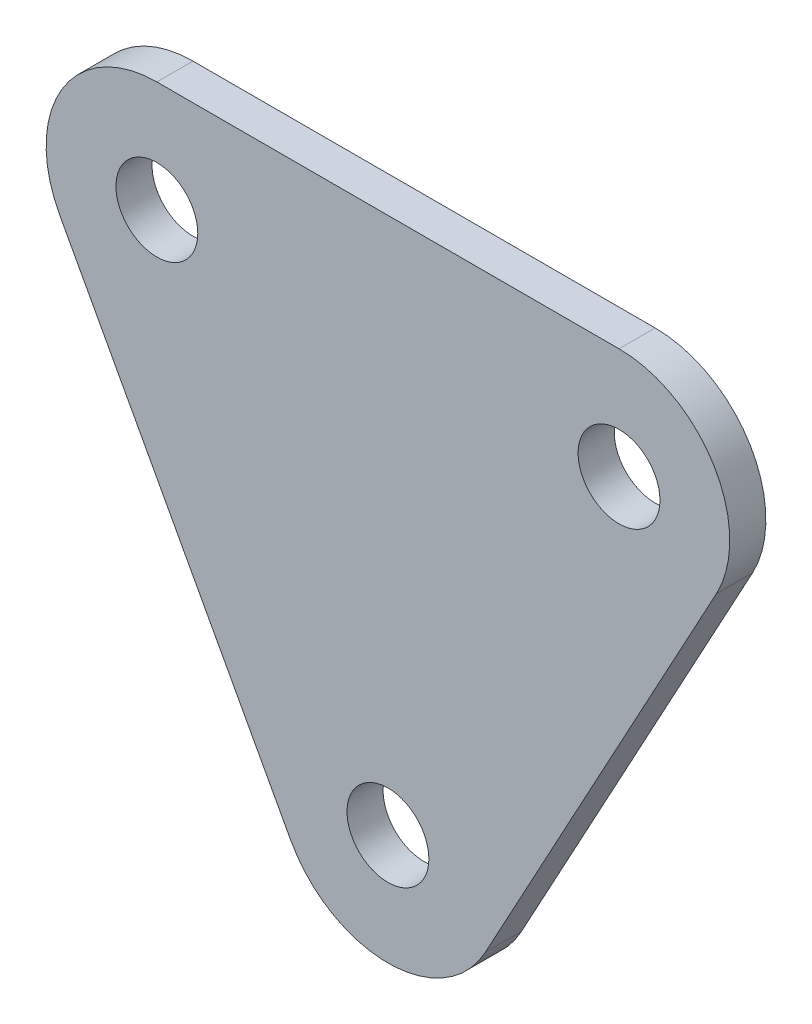
ISO-10303-21;
HEADER;
FILE_DESCRIPTION(('STEP AP214'),'2;1');
FILE_NAME('part.step','',(''),(''),'','','');
FILE_SCHEMA(('AUTOMOTIVE_DESIGN { 1 0 10303 214 1 1 1 1 }'));
ENDSEC;
DATA;
#1=APPLICATION_CONTEXT('core data for automotive mechanical design processes');
#2=APPLICATION_PROTOCOL_DEFINITION('international standard','automotive_design',2000,#1);
#3=PRODUCT_CONTEXT('',#1,'mechanical');
#4=PRODUCT('Part','Part','',(#3));
#5=PRODUCT_RELATED_PRODUCT_CATEGORY('part','',(#4));
#6=PRODUCT_DEFINITION_FORMATION('','',#4);
#7=PRODUCT_DEFINITION_CONTEXT('part definition',#1,'design');
#8=PRODUCT_DEFINITION('design','',#6,#7);
#9=PRODUCT_DEFINITION_SHAPE('','',#8);
#10=(LENGTH_UNIT() NAMED_UNIT(*) SI_UNIT(.MILLI.,.METRE.));
#11=(NAMED_UNIT(*) PLANE_ANGLE_UNIT() SI_UNIT($,.RADIAN.));
#12=(NAMED_UNIT(*) SI_UNIT($,.STERADIAN.) SOLID_ANGLE_UNIT());
#13=UNCERTAINTY_MEASURE_WITH_UNIT(LENGTH_MEASURE(1.E-05),#10,'distance_accuracy_value','');
#14=(GEOMETRIC_REPRESENTATION_CONTEXT(3) GLOBAL_UNCERTAINTY_ASSIGNED_CONTEXT((#13)) GLOBAL_UNIT_ASSIGNED_CONTEXT((#10,
#11,#12)) REPRESENTATION_CONTEXT('',''));
#15=CARTESIAN_POINT('',(0.,0.,0.));
#16=DIRECTION('',(0.,0.,1.));
#17=DIRECTION('',(1.,0.,0.));
#18=AXIS2_PLACEMENT_3D('',#15,#16,#17);
#19=CARTESIAN_POINT('',(86.6397258626879,-111.5,7.5));
#20=DIRECTION('',(0.,0.,-1.));
#21=DIRECTION('',(-1.,0.,0.));
#22=AXIS2_PLACEMENT_3D('',#19,#20,#21);
#23=PLANE('',#22);
#24=CARTESIAN_POINT('',(86.6397258626879,-111.5,7.5));
#25=DIRECTION('',(0.,0.,1.));
#26=DIRECTION('',(-1.,0.,0.));
#27=AXIS2_PLACEMENT_3D('',#24,#25,#26);
#28=CIRCLE('',#27,23.);
#29=CARTESIAN_POINT('',(66.4219931816631,-122.465549928691,7.5));
#30=VERTEX_POINT('',#29);
#31=CARTESIAN_POINT('',(106.857458543713,-122.465549928691,7.5));
#32=VERTEX_POINT('',#31);
#33=EDGE_CURVE('E129',#30,#32,#28,.T.);
#34=ORIENTED_EDGE('',*,*,#33,.T.);
#35=DIRECTION('',(0.476763040377887,0.879031855696728,0.));
#36=VECTOR('',#35,1.);
#37=CARTESIAN_POINT('',(154.857458543713,-33.9655499286914,7.5));
#38=LINE('',#37,#36);
#39=CARTESIAN_POINT('',(154.857458543713,-33.9655499286914,7.5));
#40=VERTEX_POINT('',#39);
#41=EDGE_CURVE('E87',#32,#40,#38,.T.);
#42=ORIENTED_EDGE('',*,*,#41,.T.);
#43=CARTESIAN_POINT('',(134.639725862688,-23.,7.5));
#44=DIRECTION('',(0.,0.,1.));
#45=DIRECTION('',(-1.,0.,0.));
#46=AXIS2_PLACEMENT_3D('',#43,#44,#45);
#47=CIRCLE('',#46,23.);
#48=CARTESIAN_POINT('',(134.639725862688,0.,7.5));
#49=VERTEX_POINT('',#48);
#50=EDGE_CURVE('E100',#40,#49,#47,.T.);
#51=ORIENTED_EDGE('',*,*,#50,.T.);
#52=DIRECTION('',(-1.,0.,0.));
#53=VECTOR('',#52,1.);
#54=CARTESIAN_POINT('',(38.6397258626879,0.,7.5));
#55=LINE('',#54,#53);
#56=CARTESIAN_POINT('',(38.6397258626879,0.,7.5));
#57=VERTEX_POINT('',#56);
#58=EDGE_CURVE('E94',#49,#57,#55,.T.);
#59=ORIENTED_EDGE('',*,*,#58,.T.);
#60=CARTESIAN_POINT('',(38.6397258626879,-23.,7.5));
#61=DIRECTION('',(0.,0.,1.));
#62=DIRECTION('',(1.,0.,0.));
#63=AXIS2_PLACEMENT_3D('',#60,#61,#62);
#64=CIRCLE('',#63,23.);
#65=CARTESIAN_POINT('',(18.4219931816631,-33.9655499286914,7.5));
#66=VERTEX_POINT('',#65);
#67=EDGE_CURVE('E98',#57,#66,#64,.T.);
#68=ORIENTED_EDGE('',*,*,#67,.T.);
#69=DIRECTION('',(0.476763040377886,-0.879031855696728,0.));
#70=VECTOR('',#69,1.);
#71=CARTESIAN_POINT('',(66.4219931816631,-122.465549928691,7.5));
#72=LINE('',#71,#70);
#73=EDGE_CURVE('E50',#66,#30,#72,.T.);
#74=ORIENTED_EDGE('',*,*,#73,.T.);
#75=EDGE_LOOP('',(#34,#42,#51,#59,#68,#74));
#76=FACE_BOUND('',#75,.T.);
#77=CARTESIAN_POINT('',(38.6397258626879,-23.,7.5));
#78=DIRECTION('',(0.,0.,1.));
#79=DIRECTION('',(1.,0.,0.));
#80=AXIS2_PLACEMENT_3D('',#77,#78,#79);
#81=CIRCLE('',#80,8.5);
#82=CARTESIAN_POINT('',(47.1397258626879,-23.,7.5));
#83=VERTEX_POINT('',#82);
#84=EDGE_CURVE('E122',#83,#83,#81,.T.);
#85=ORIENTED_EDGE('',*,*,#84,.F.);
#86=EDGE_LOOP('',(#85));
#87=FACE_BOUND('',#86,.T.);
#88=CARTESIAN_POINT('',(134.639725862688,-23.,7.5));
#89=DIRECTION('',(0.,0.,1.));
#90=DIRECTION('',(1.,0.,0.));
#91=AXIS2_PLACEMENT_3D('',#88,#89,#90);
#92=CIRCLE('',#91,8.50000000000001);
#93=CARTESIAN_POINT('',(143.139725862688,-23.,7.5));
#94=VERTEX_POINT('',#93);
#95=EDGE_CURVE('E183',#94,#94,#92,.T.);
#96=ORIENTED_EDGE('',*,*,#95,.F.);
#97=EDGE_LOOP('',(#96));
#98=FACE_BOUND('',#97,.T.);
#99=CARTESIAN_POINT('',(86.6397258626879,-111.5,7.5));
#100=DIRECTION('',(0.,0.,1.));
#101=DIRECTION('',(1.,0.,0.));
#102=AXIS2_PLACEMENT_3D('',#99,#100,#101);
#103=CIRCLE('',#102,8.49999999999999);
#104=CARTESIAN_POINT('',(95.1397258626879,-111.5,7.5));
#105=VERTEX_POINT('',#104);
#106=EDGE_CURVE('E174',#105,#105,#103,.T.);
#107=ORIENTED_EDGE('',*,*,#106,.F.);
#108=EDGE_LOOP('',(#107));
#109=FACE_BOUND('',#108,.T.);
#110=ADVANCED_FACE('F33',(#76,#87,#98,#109),#23,.F.);
#111=CARTESIAN_POINT('',(86.6397258626879,-111.5,0.));
#112=DIRECTION('',(0.,0.,-1.));
#113=DIRECTION('',(-1.,0.,0.));
#114=AXIS2_PLACEMENT_3D('',#111,#112,#113);
#115=PLANE('',#114);
#116=CARTESIAN_POINT('',(134.639725862688,-23.,0.));
#117=DIRECTION('',(0.,0.,1.));
#118=DIRECTION('',(1.,0.,0.));
#119=AXIS2_PLACEMENT_3D('',#116,#117,#118);
#120=CIRCLE('',#119,8.50000000000001);
#121=CARTESIAN_POINT('',(143.139725862688,-23.,0.));
#122=VERTEX_POINT('',#121);
#123=EDGE_CURVE('E180',#122,#122,#120,.T.);
#124=ORIENTED_EDGE('',*,*,#123,.T.);
#125=EDGE_LOOP('',(#124));
#126=FACE_BOUND('',#125,.T.);
#127=CARTESIAN_POINT('',(86.6397258626879,-111.5,0.));
#128=DIRECTION('',(0.,0.,1.));
#129=DIRECTION('',(-1.,0.,0.));
#130=AXIS2_PLACEMENT_3D('',#127,#128,#129);
#131=CIRCLE('',#130,23.);
#132=CARTESIAN_POINT('',(66.4219931816631,-122.465549928691,0.));
#133=VERTEX_POINT('',#132);
#134=CARTESIAN_POINT('',(106.857458543713,-122.465549928691,0.));
#135=VERTEX_POINT('',#134);
#136=EDGE_CURVE('E118',#133,#135,#131,.T.);
#137=ORIENTED_EDGE('',*,*,#136,.F.);
#138=DIRECTION('',(0.476763040377886,-0.879031855696728,0.));
#139=VECTOR('',#138,1.);
#140=CARTESIAN_POINT('',(66.4219931816631,-122.465549928691,0.));
#141=LINE('',#140,#139);
#142=CARTESIAN_POINT('',(18.4219931816631,-33.9655499286914,0.));
#143=VERTEX_POINT('',#142);
#144=EDGE_CURVE('E79',#143,#133,#141,.T.);
#145=ORIENTED_EDGE('',*,*,#144,.F.);
#146=CARTESIAN_POINT('',(38.6397258626879,-23.,0.));
#147=DIRECTION('',(0.,0.,1.));
#148=DIRECTION('',(1.,0.,0.));
#149=AXIS2_PLACEMENT_3D('',#146,#147,#148);
#150=CIRCLE('',#149,23.);
#151=CARTESIAN_POINT('',(38.6397258626879,0.,0.));
#152=VERTEX_POINT('',#151);
#153=EDGE_CURVE('E73',#152,#143,#150,.T.);
#154=ORIENTED_EDGE('',*,*,#153,.F.);
#155=DIRECTION('',(-1.,0.,0.));
#156=VECTOR('',#155,1.);
#157=CARTESIAN_POINT('',(38.6397258626879,0.,0.));
#158=LINE('',#157,#156);
#159=CARTESIAN_POINT('',(134.639725862688,0.,0.));
#160=VERTEX_POINT('',#159);
#161=EDGE_CURVE('E108',#160,#152,#158,.T.);
#162=ORIENTED_EDGE('',*,*,#161,.F.);
#163=CARTESIAN_POINT('',(134.639725862688,-23.,0.));
#164=DIRECTION('',(0.,0.,1.));
#165=DIRECTION('',(-1.,0.,0.));
#166=AXIS2_PLACEMENT_3D('',#163,#164,#165);
#167=CIRCLE('',#166,23.);
#168=CARTESIAN_POINT('',(154.857458543713,-33.9655499286914,0.));
#169=VERTEX_POINT('',#168);
#170=EDGE_CURVE('E124',#169,#160,#167,.T.);
#171=ORIENTED_EDGE('',*,*,#170,.F.);
#172=DIRECTION('',(0.476763040377887,0.879031855696728,0.));
#173=VECTOR('',#172,1.);
#174=CARTESIAN_POINT('',(154.857458543713,-33.9655499286914,0.));
#175=LINE('',#174,#173);
#176=EDGE_CURVE('E121',#135,#169,#175,.T.);
#177=ORIENTED_EDGE('',*,*,#176,.F.);
#178=EDGE_LOOP('',(#137,#145,#154,#162,#171,#177));
#179=FACE_BOUND('',#178,.T.);
#180=CARTESIAN_POINT('',(38.6397258626879,-23.,0.));
#181=DIRECTION('',(0.,0.,1.));
#182=DIRECTION('',(1.,0.,0.));
#183=AXIS2_PLACEMENT_3D('',#180,#181,#182);
#184=CIRCLE('',#183,8.5);
#185=CARTESIAN_POINT('',(47.1397258626879,-23.,0.));
#186=VERTEX_POINT('',#185);
#187=EDGE_CURVE('E186',#186,#186,#184,.T.);
#188=ORIENTED_EDGE('',*,*,#187,.T.);
#189=EDGE_LOOP('',(#188));
#190=FACE_BOUND('',#189,.T.);
#191=CARTESIAN_POINT('',(86.6397258626879,-111.5,0.));
#192=DIRECTION('',(0.,0.,1.));
#193=DIRECTION('',(1.,0.,0.));
#194=AXIS2_PLACEMENT_3D('',#191,#192,#193);
#195=CIRCLE('',#194,8.49999999999999);
#196=CARTESIAN_POINT('',(95.1397258626879,-111.5,0.));
#197=VERTEX_POINT('',#196);
#198=EDGE_CURVE('E177',#197,#197,#195,.T.);
#199=ORIENTED_EDGE('',*,*,#198,.T.);
#200=EDGE_LOOP('',(#199));
#201=FACE_BOUND('',#200,.T.);
#202=ADVANCED_FACE('F138',(#126,#179,#190,#201),#115,.T.);
#203=CARTESIAN_POINT('',(86.6397258626879,-111.5,7.5));
#204=DIRECTION('',(0.,0.,-1.));
#205=DIRECTION('',(-1.,0.,0.));
#206=AXIS2_PLACEMENT_3D('',#203,#204,#205);
#207=CYLINDRICAL_SURFACE('',#206,23.);
#208=ORIENTED_EDGE('',*,*,#136,.T.);
#209=DIRECTION('',(0.,0.,-1.));
#210=VECTOR('',#209,1.);
#211=CARTESIAN_POINT('',(106.857458543713,-122.465549928691,7.5));
#212=LINE('',#211,#210);
#213=EDGE_CURVE('E11',#32,#135,#212,.T.);
#214=ORIENTED_EDGE('',*,*,#213,.F.);
#215=ORIENTED_EDGE('',*,*,#33,.F.);
#216=DIRECTION('',(0.,0.,-1.));
#217=VECTOR('',#216,1.);
#218=CARTESIAN_POINT('',(66.4219931816631,-122.465549928691,7.5));
#219=LINE('',#218,#217);
#220=EDGE_CURVE('E114',#30,#133,#219,.T.);
#221=ORIENTED_EDGE('',*,*,#220,.T.);
#222=EDGE_LOOP('',(#208,#214,#215,#221));
#223=FACE_BOUND('',#222,.T.);
#224=ADVANCED_FACE('F35',(#223),#207,.T.);
#225=CARTESIAN_POINT('',(154.857458543713,-33.9655499286914,7.5));
#226=DIRECTION('',(-0.879031855696728,0.476763040377887,0.));
#227=DIRECTION('',(-0.476763040377887,-0.879031855696728,0.));
#228=AXIS2_PLACEMENT_3D('',#225,#226,#227);
#229=PLANE('',#228);
#230=ORIENTED_EDGE('',*,*,#176,.T.);
#231=DIRECTION('',(0.,0.,-1.));
#232=VECTOR('',#231,1.);
#233=CARTESIAN_POINT('',(154.857458543713,-33.9655499286914,7.5));
#234=LINE('',#233,#232);
#235=EDGE_CURVE('E42',#40,#169,#234,.T.);
#236=ORIENTED_EDGE('',*,*,#235,.F.);
#237=ORIENTED_EDGE('',*,*,#41,.F.);
#238=ORIENTED_EDGE('',*,*,#213,.T.);
#239=EDGE_LOOP('',(#230,#236,#237,#238));
#240=FACE_BOUND('',#239,.T.);
#241=ADVANCED_FACE('F237',(#240),#229,.F.);
#242=CARTESIAN_POINT('',(134.639725862688,-23.,7.5));
#243=DIRECTION('',(0.,0.,-1.));
#244=DIRECTION('',(-1.,0.,0.));
#245=AXIS2_PLACEMENT_3D('',#242,#243,#244);
#246=CYLINDRICAL_SURFACE('',#245,23.);
#247=ORIENTED_EDGE('',*,*,#170,.T.);
#248=DIRECTION('',(0.,0.,-1.));
#249=VECTOR('',#248,1.);
#250=CARTESIAN_POINT('',(134.639725862688,0.,7.5));
#251=LINE('',#250,#249);
#252=EDGE_CURVE('E109',#49,#160,#251,.T.);
#253=ORIENTED_EDGE('',*,*,#252,.F.);
#254=ORIENTED_EDGE('',*,*,#50,.F.);
#255=ORIENTED_EDGE('',*,*,#235,.T.);
#256=EDGE_LOOP('',(#247,#253,#254,#255));
#257=FACE_BOUND('',#256,.T.);
#258=ADVANCED_FACE('F135',(#257),#246,.T.);
#259=CARTESIAN_POINT('',(38.6397258626879,0.,7.5));
#260=DIRECTION('',(0.,-1.,0.));
#261=DIRECTION('',(0.,0.,-1.));
#262=AXIS2_PLACEMENT_3D('',#259,#260,#261);
#263=PLANE('',#262);
#264=ORIENTED_EDGE('',*,*,#161,.T.);
#265=DIRECTION('',(0.,0.,-1.));
#266=VECTOR('',#265,1.);
#267=CARTESIAN_POINT('',(38.6397258626879,0.,7.5));
#268=LINE('',#267,#266);
#269=EDGE_CURVE('E105',#57,#152,#268,.T.);
#270=ORIENTED_EDGE('',*,*,#269,.F.);
#271=ORIENTED_EDGE('',*,*,#58,.F.);
#272=ORIENTED_EDGE('',*,*,#252,.T.);
#273=EDGE_LOOP('',(#264,#270,#271,#272));
#274=FACE_BOUND('',#273,.T.);
#275=ADVANCED_FACE('F106',(#274),#263,.F.);
#276=CARTESIAN_POINT('',(38.6397258626879,-23.,7.5));
#277=DIRECTION('',(0.,0.,-1.));
#278=DIRECTION('',(-1.,0.,0.));
#279=AXIS2_PLACEMENT_3D('',#276,#277,#278);
#280=CYLINDRICAL_SURFACE('',#279,23.);
#281=ORIENTED_EDGE('',*,*,#153,.T.);
#282=DIRECTION('',(0.,0.,-1.));
#283=VECTOR('',#282,1.);
#284=CARTESIAN_POINT('',(18.4219931816631,-33.9655499286914,7.5));
#285=LINE('',#284,#283);
#286=EDGE_CURVE('E110',#66,#143,#285,.T.);
#287=ORIENTED_EDGE('',*,*,#286,.F.);
#288=ORIENTED_EDGE('',*,*,#67,.F.);
#289=ORIENTED_EDGE('',*,*,#269,.T.);
#290=EDGE_LOOP('',(#281,#287,#288,#289));
#291=FACE_BOUND('',#290,.T.);
#292=ADVANCED_FACE('F112',(#291),#280,.T.);
#293=CARTESIAN_POINT('',(66.4219931816631,-122.465549928691,7.5));
#294=DIRECTION('',(0.879031855696728,0.476763040377886,0.));
#295=DIRECTION('',(-0.476763040377887,0.879031855696728,0.));
#296=AXIS2_PLACEMENT_3D('',#293,#294,#295);
#297=PLANE('',#296);
#298=ORIENTED_EDGE('',*,*,#144,.T.);
#299=ORIENTED_EDGE('',*,*,#220,.F.);
#300=ORIENTED_EDGE('',*,*,#73,.F.);
#301=ORIENTED_EDGE('',*,*,#286,.T.);
#302=EDGE_LOOP('',(#298,#299,#300,#301));
#303=FACE_BOUND('',#302,.T.);
#304=ADVANCED_FACE('F143',(#303),#297,.F.);
#305=CARTESIAN_POINT('',(38.6397258626879,-23.,7.5));
#306=DIRECTION('',(0.,0.,-1.));
#307=DIRECTION('',(-1.,0.,0.));
#308=AXIS2_PLACEMENT_3D('',#305,#306,#307);
#309=CYLINDRICAL_SURFACE('',#308,8.5);
#310=ORIENTED_EDGE('',*,*,#84,.T.);
#311=EDGE_LOOP('',(#310));
#312=FACE_BOUND('',#311,.T.);
#313=ORIENTED_EDGE('',*,*,#187,.F.);
#314=EDGE_LOOP('',(#313));
#315=FACE_BOUND('',#314,.T.);
#316=ADVANCED_FACE('F145',(#312,#315),#309,.F.);
#317=CARTESIAN_POINT('',(134.639725862688,-23.,7.5));
#318=DIRECTION('',(0.,0.,-1.));
#319=DIRECTION('',(-1.,0.,0.));
#320=AXIS2_PLACEMENT_3D('',#317,#318,#319);
#321=CYLINDRICAL_SURFACE('',#320,8.50000000000001);
#322=ORIENTED_EDGE('',*,*,#95,.T.);
#323=EDGE_LOOP('',(#322));
#324=FACE_BOUND('',#323,.T.);
#325=ORIENTED_EDGE('',*,*,#123,.F.);
#326=EDGE_LOOP('',(#325));
#327=FACE_BOUND('',#326,.T.);
#328=ADVANCED_FACE('F151',(#324,#327),#321,.F.);
#329=CARTESIAN_POINT('',(86.6397258626879,-111.5,7.5));
#330=DIRECTION('',(0.,0.,-1.));
#331=DIRECTION('',(-1.,0.,0.));
#332=AXIS2_PLACEMENT_3D('',#329,#330,#331);
#333=CYLINDRICAL_SURFACE('',#332,8.49999999999999);
#334=ORIENTED_EDGE('',*,*,#106,.T.);
#335=EDGE_LOOP('',(#334));
#336=FACE_BOUND('',#335,.T.);
#337=ORIENTED_EDGE('',*,*,#198,.F.);
#338=EDGE_LOOP('',(#337));
#339=FACE_BOUND('',#338,.T.);
#340=ADVANCED_FACE('F165',(#336,#339),#333,.F.);
#341=CLOSED_SHELL('',(#110,#202,#224,#241,#258,#275,#292,#304,#316,#328,#340));
#342=MANIFOLD_SOLID_BREP('B2',#341);
#343=ADVANCED_BREP_SHAPE_REPRESENTATION('',(#18,#342),#14);
#344=SHAPE_DEFINITION_REPRESENTATION(#9,#343);
ENDSEC;
END-ISO-10303-21;
